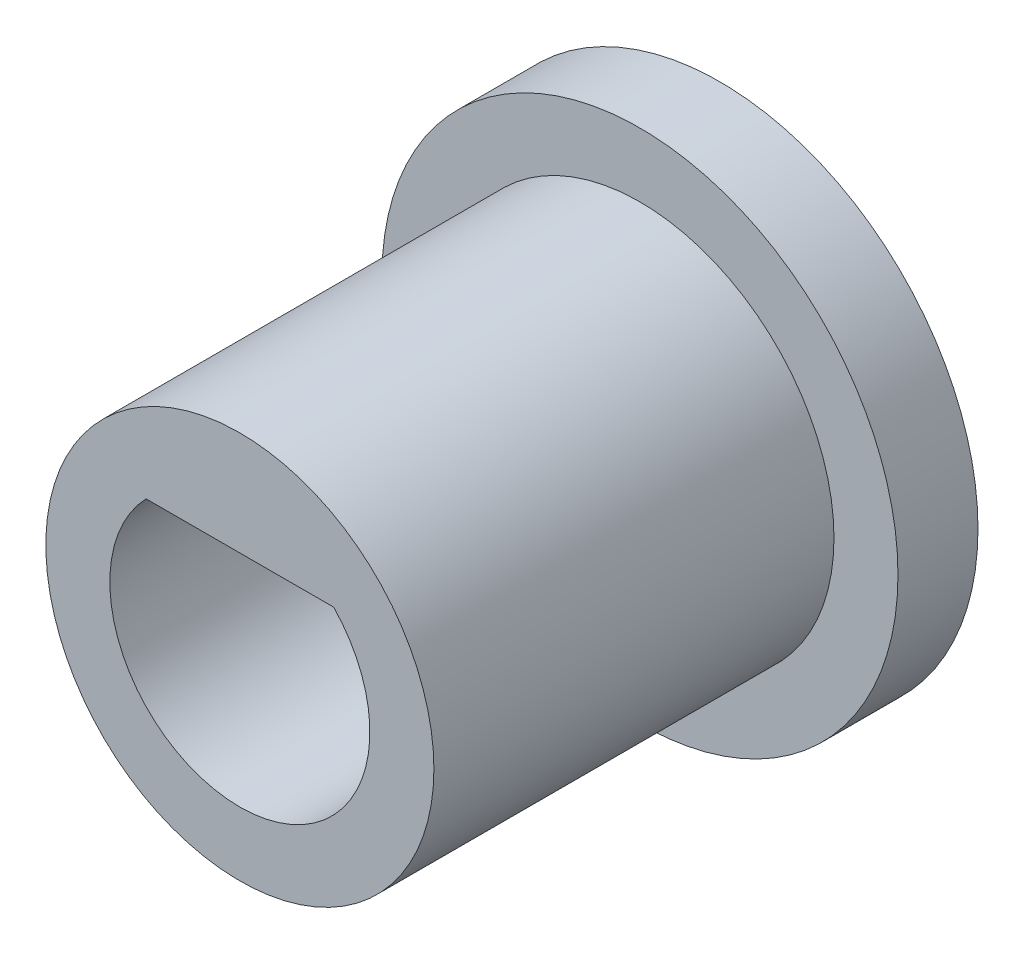
ISO-10303-21;
HEADER;
FILE_DESCRIPTION(('STEP AP214'),'2;1');
FILE_NAME('part.step','',(''),(''),'','','');
FILE_SCHEMA(('AUTOMOTIVE_DESIGN { 1 0 10303 214 1 1 1 1 }'));
ENDSEC;
DATA;
#1=APPLICATION_CONTEXT('core data for automotive mechanical design processes');
#2=APPLICATION_PROTOCOL_DEFINITION('international standard','automotive_design',2000,#1);
#3=PRODUCT_CONTEXT('',#1,'mechanical');
#4=PRODUCT('Part','Part','',(#3));
#5=PRODUCT_RELATED_PRODUCT_CATEGORY('part','',(#4));
#6=PRODUCT_DEFINITION_FORMATION('','',#4);
#7=PRODUCT_DEFINITION_CONTEXT('part definition',#1,'design');
#8=PRODUCT_DEFINITION('design','',#6,#7);
#9=PRODUCT_DEFINITION_SHAPE('','',#8);
#10=(LENGTH_UNIT() NAMED_UNIT(*) SI_UNIT(.MILLI.,.METRE.));
#11=(NAMED_UNIT(*) PLANE_ANGLE_UNIT() SI_UNIT($,.RADIAN.));
#12=(NAMED_UNIT(*) SI_UNIT($,.STERADIAN.) SOLID_ANGLE_UNIT());
#13=UNCERTAINTY_MEASURE_WITH_UNIT(LENGTH_MEASURE(1.E-05),#10,'distance_accuracy_value','');
#14=(GEOMETRIC_REPRESENTATION_CONTEXT(3) GLOBAL_UNCERTAINTY_ASSIGNED_CONTEXT((#13)) GLOBAL_UNIT_ASSIGNED_CONTEXT((#10,
#11,#12)) REPRESENTATION_CONTEXT('',''));
#15=CARTESIAN_POINT('',(0.,0.,0.));
#16=DIRECTION('',(0.,0.,1.));
#17=DIRECTION('',(1.,0.,0.));
#18=AXIS2_PLACEMENT_3D('',#15,#16,#17);
#19=CARTESIAN_POINT('',(0.,1.125,5.));
#20=DIRECTION('',(0.,1.,0.));
#21=DIRECTION('',(0.,0.,1.));
#22=AXIS2_PLACEMENT_3D('',#19,#20,#21);
#23=PLANE('',#22);
#24=DIRECTION('',(0.,0.,-1.));
#25=VECTOR('',#24,1.);
#26=CARTESIAN_POINT('',(-1.17260393995586,1.125,5.));
#27=LINE('',#26,#25);
#28=CARTESIAN_POINT('',(-1.17260393995586,1.125,5.));
#29=VERTEX_POINT('',#28);
#30=CARTESIAN_POINT('',(-1.17260393995586,1.125,-1.));
#31=VERTEX_POINT('',#30);
#32=EDGE_CURVE('E44',#29,#31,#27,.T.);
#33=ORIENTED_EDGE('',*,*,#32,.T.);
#34=DIRECTION('',(1.,0.,0.));
#35=VECTOR('',#34,1.);
#36=CARTESIAN_POINT('',(0.,1.125,-1.));
#37=LINE('',#36,#35);
#38=CARTESIAN_POINT('',(1.17260393995586,1.125,-1.));
#39=VERTEX_POINT('',#38);
#40=EDGE_CURVE('E64',#31,#39,#37,.T.);
#41=ORIENTED_EDGE('',*,*,#40,.T.);
#42=DIRECTION('',(0.,0.,-1.));
#43=VECTOR('',#42,1.);
#44=CARTESIAN_POINT('',(1.17260393995586,1.125,5.));
#45=LINE('',#44,#43);
#46=CARTESIAN_POINT('',(1.17260393995586,1.125,5.));
#47=VERTEX_POINT('',#46);
#48=EDGE_CURVE('E11',#47,#39,#45,.T.);
#49=ORIENTED_EDGE('',*,*,#48,.F.);
#50=DIRECTION('',(1.,0.,0.));
#51=VECTOR('',#50,1.);
#52=CARTESIAN_POINT('',(0.,1.125,5.));
#53=LINE('',#52,#51);
#54=EDGE_CURVE('E56',#29,#47,#53,.T.);
#55=ORIENTED_EDGE('',*,*,#54,.F.);
#56=EDGE_LOOP('',(#33,#41,#49,#55));
#57=FACE_BOUND('',#56,.T.);
#58=ADVANCED_FACE('F37',(#57),#23,.F.);
#59=CARTESIAN_POINT('',(0.,0.,5.));
#60=DIRECTION('',(0.,0.,-1.));
#61=DIRECTION('',(-1.,0.,0.));
#62=AXIS2_PLACEMENT_3D('',#59,#60,#61);
#63=CYLINDRICAL_SURFACE('',#62,1.625);
#64=ORIENTED_EDGE('',*,*,#48,.T.);
#65=CARTESIAN_POINT('',(0.,0.,-1.));
#66=DIRECTION('',(0.,0.,1.));
#67=DIRECTION('',(1.,0.,0.));
#68=AXIS2_PLACEMENT_3D('',#65,#66,#67);
#69=CIRCLE('',#68,1.625);
#70=EDGE_CURVE('E67',#31,#39,#69,.T.);
#71=ORIENTED_EDGE('',*,*,#70,.F.);
#72=ORIENTED_EDGE('',*,*,#32,.F.);
#73=CARTESIAN_POINT('',(0.,0.,5.));
#74=DIRECTION('',(0.,0.,1.));
#75=DIRECTION('',(1.,0.,0.));
#76=AXIS2_PLACEMENT_3D('',#73,#74,#75);
#77=CIRCLE('',#76,1.625);
#78=EDGE_CURVE('E83',#29,#47,#77,.T.);
#79=ORIENTED_EDGE('',*,*,#78,.T.);
#80=EDGE_LOOP('',(#64,#71,#72,#79));
#81=FACE_BOUND('',#80,.T.);
#82=ADVANCED_FACE('F68',(#81),#63,.F.);
#83=CARTESIAN_POINT('',(0.,0.,5.));
#84=DIRECTION('',(0.,0.,-1.));
#85=DIRECTION('',(-1.,0.,0.));
#86=AXIS2_PLACEMENT_3D('',#83,#84,#85);
#87=CYLINDRICAL_SURFACE('',#86,2.425);
#88=CARTESIAN_POINT('',(0.,0.,5.));
#89=DIRECTION('',(0.,0.,1.));
#90=DIRECTION('',(1.,0.,0.));
#91=AXIS2_PLACEMENT_3D('',#88,#89,#90);
#92=CIRCLE('',#91,2.425);
#93=CARTESIAN_POINT('',(2.425,0.,5.));
#94=VERTEX_POINT('',#93);
#95=EDGE_CURVE('E65',#94,#94,#92,.T.);
#96=ORIENTED_EDGE('',*,*,#95,.F.);
#97=EDGE_LOOP('',(#96));
#98=FACE_BOUND('',#97,.T.);
#99=CARTESIAN_POINT('',(0.,0.,0.));
#100=DIRECTION('',(0.,0.,1.));
#101=DIRECTION('',(1.,0.,0.));
#102=AXIS2_PLACEMENT_3D('',#99,#100,#101);
#103=CIRCLE('',#102,2.425);
#104=CARTESIAN_POINT('',(2.425,0.,0.));
#105=VERTEX_POINT('',#104);
#106=EDGE_CURVE('E73',#105,#105,#103,.T.);
#107=ORIENTED_EDGE('',*,*,#106,.T.);
#108=EDGE_LOOP('',(#107));
#109=FACE_BOUND('',#108,.T.);
#110=ADVANCED_FACE('F90',(#98,#109),#87,.T.);
#111=CARTESIAN_POINT('',(0.,0.,5.));
#112=DIRECTION('',(0.,0.,1.));
#113=DIRECTION('',(1.,0.,0.));
#114=AXIS2_PLACEMENT_3D('',#111,#112,#113);
#115=PLANE('',#114);
#116=ORIENTED_EDGE('',*,*,#54,.T.);
#117=ORIENTED_EDGE('',*,*,#78,.F.);
#118=EDGE_LOOP('',(#116,#117));
#119=FACE_BOUND('',#118,.T.);
#120=ORIENTED_EDGE('',*,*,#95,.T.);
#121=EDGE_LOOP('',(#120));
#122=FACE_BOUND('',#121,.T.);
#123=ADVANCED_FACE('F88',(#119,#122),#115,.T.);
#124=CARTESIAN_POINT('',(0.,0.,0.));
#125=DIRECTION('',(0.,0.,1.));
#126=DIRECTION('',(1.,0.,0.));
#127=AXIS2_PLACEMENT_3D('',#124,#125,#126);
#128=PLANE('',#127);
#129=CARTESIAN_POINT('',(0.,0.,0.));
#130=DIRECTION('',(0.,0.,1.));
#131=DIRECTION('',(1.,0.,0.));
#132=AXIS2_PLACEMENT_3D('',#129,#130,#131);
#133=CIRCLE('',#132,3.225);
#134=CARTESIAN_POINT('',(3.225,0.,0.));
#135=VERTEX_POINT('',#134);
#136=EDGE_CURVE('E79',#135,#135,#133,.T.);
#137=ORIENTED_EDGE('',*,*,#136,.T.);
#138=EDGE_LOOP('',(#137));
#139=FACE_BOUND('',#138,.T.);
#140=ORIENTED_EDGE('',*,*,#106,.F.);
#141=EDGE_LOOP('',(#140));
#142=FACE_BOUND('',#141,.T.);
#143=ADVANCED_FACE('F96',(#139,#142),#128,.T.);
#144=CARTESIAN_POINT('',(0.,0.,-1.));
#145=DIRECTION('',(0.,0.,1.));
#146=DIRECTION('',(1.,0.,0.));
#147=AXIS2_PLACEMENT_3D('',#144,#145,#146);
#148=CYLINDRICAL_SURFACE('',#147,3.225);
#149=CARTESIAN_POINT('',(0.,0.,-1.));
#150=DIRECTION('',(0.,0.,1.));
#151=DIRECTION('',(1.,0.,0.));
#152=AXIS2_PLACEMENT_3D('',#149,#150,#151);
#153=CIRCLE('',#152,3.225);
#154=CARTESIAN_POINT('',(3.225,0.,-1.));
#155=VERTEX_POINT('',#154);
#156=EDGE_CURVE('E70',#155,#155,#153,.T.);
#157=ORIENTED_EDGE('',*,*,#156,.T.);
#158=EDGE_LOOP('',(#157));
#159=FACE_BOUND('',#158,.T.);
#160=ORIENTED_EDGE('',*,*,#136,.F.);
#161=EDGE_LOOP('',(#160));
#162=FACE_BOUND('',#161,.T.);
#163=ADVANCED_FACE('F98',(#159,#162),#148,.T.);
#164=CARTESIAN_POINT('',(0.,0.,-1.));
#165=DIRECTION('',(0.,0.,1.));
#166=DIRECTION('',(1.,0.,0.));
#167=AXIS2_PLACEMENT_3D('',#164,#165,#166);
#168=PLANE('',#167);
#169=ORIENTED_EDGE('',*,*,#156,.F.);
#170=EDGE_LOOP('',(#169));
#171=FACE_BOUND('',#170,.T.);
#172=ORIENTED_EDGE('',*,*,#70,.T.);
#173=ORIENTED_EDGE('',*,*,#40,.F.);
#174=EDGE_LOOP('',(#172,#173));
#175=FACE_BOUND('',#174,.T.);
#176=ADVANCED_FACE('F72',(#171,#175),#168,.F.);
#177=CLOSED_SHELL('',(#58,#82,#110,#123,#143,#163,#176));
#178=MANIFOLD_SOLID_BREP('B2',#177);
#179=ADVANCED_BREP_SHAPE_REPRESENTATION('',(#18,#178),#14);
#180=SHAPE_DEFINITION_REPRESENTATION(#9,#179);
ENDSEC;
END-ISO-10303-21;
